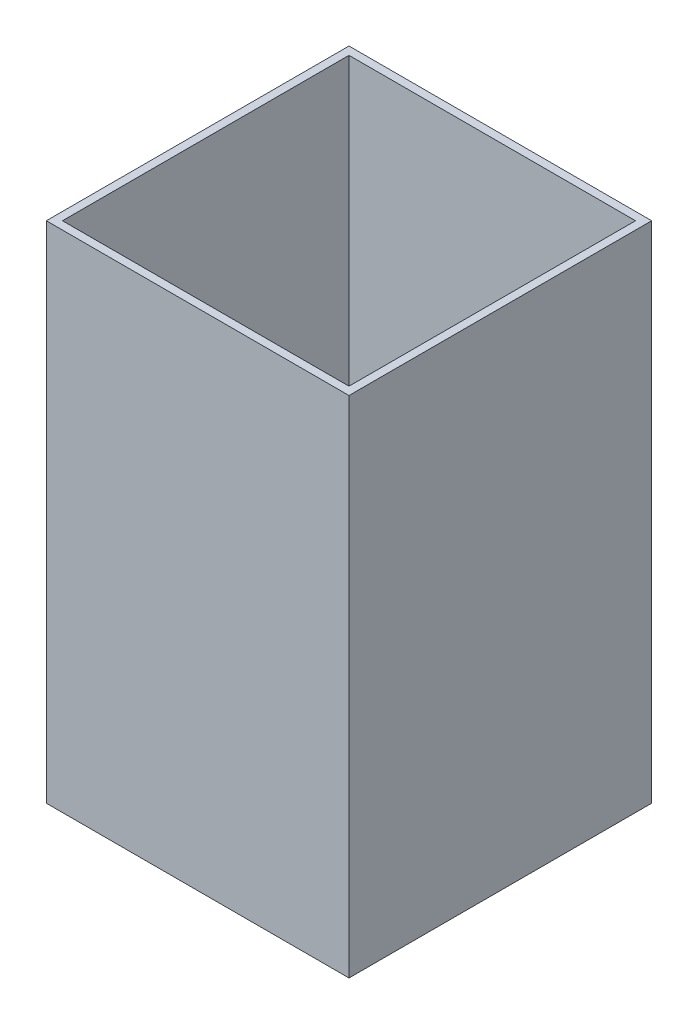
ISO-10303-21;
HEADER;
FILE_DESCRIPTION(('STEP AP214'),'2;1');
FILE_NAME('part.step','',(''),(''),'','','');
FILE_SCHEMA(('AUTOMOTIVE_DESIGN { 1 0 10303 214 1 1 1 1 }'));
ENDSEC;
DATA;
#1=APPLICATION_CONTEXT('core data for automotive mechanical design processes');
#2=APPLICATION_PROTOCOL_DEFINITION('international standard','automotive_design',2000,#1);
#3=PRODUCT_CONTEXT('',#1,'mechanical');
#4=PRODUCT('Part','Part','',(#3));
#5=PRODUCT_RELATED_PRODUCT_CATEGORY('part','',(#4));
#6=PRODUCT_DEFINITION_FORMATION('','',#4);
#7=PRODUCT_DEFINITION_CONTEXT('part definition',#1,'design');
#8=PRODUCT_DEFINITION('design','',#6,#7);
#9=PRODUCT_DEFINITION_SHAPE('','',#8);
#10=(LENGTH_UNIT() NAMED_UNIT(*) SI_UNIT(.MILLI.,.METRE.));
#11=(NAMED_UNIT(*) PLANE_ANGLE_UNIT() SI_UNIT($,.RADIAN.));
#12=(NAMED_UNIT(*) SI_UNIT($,.STERADIAN.) SOLID_ANGLE_UNIT());
#13=UNCERTAINTY_MEASURE_WITH_UNIT(LENGTH_MEASURE(1.E-05),#10,'distance_accuracy_value','');
#14=(GEOMETRIC_REPRESENTATION_CONTEXT(3) GLOBAL_UNCERTAINTY_ASSIGNED_CONTEXT((#13)) GLOBAL_UNIT_ASSIGNED_CONTEXT((#10,
#11,#12)) REPRESENTATION_CONTEXT('',''));
#15=CARTESIAN_POINT('',(0.,0.,0.));
#16=DIRECTION('',(0.,0.,1.));
#17=DIRECTION('',(1.,0.,0.));
#18=AXIS2_PLACEMENT_3D('',#15,#16,#17);
#19=CARTESIAN_POINT('',(0.,31.75,0.));
#20=DIRECTION('',(0.,-1.,0.));
#21=DIRECTION('',(0.,0.,-1.));
#22=AXIS2_PLACEMENT_3D('',#19,#20,#21);
#23=PLANE('',#22);
#24=DIRECTION('',(0.,0.,1.));
#25=VECTOR('',#24,1.);
#26=CARTESIAN_POINT('',(0.,31.75,0.));
#27=LINE('',#26,#25);
#28=CARTESIAN_POINT('',(0.,31.75,-19.05));
#29=VERTEX_POINT('',#28);
#30=CARTESIAN_POINT('',(0.,31.75,0.));
#31=VERTEX_POINT('',#30);
#32=EDGE_CURVE('E153',#29,#31,#27,.T.);
#33=ORIENTED_EDGE('',*,*,#32,.T.);
#34=DIRECTION('',(1.,0.,0.));
#35=VECTOR('',#34,1.);
#36=CARTESIAN_POINT('',(0.,31.75,0.));
#37=LINE('',#36,#35);
#38=CARTESIAN_POINT('',(19.05,31.75,0.));
#39=VERTEX_POINT('',#38);
#40=EDGE_CURVE('E157',#31,#39,#37,.T.);
#41=ORIENTED_EDGE('',*,*,#40,.T.);
#42=DIRECTION('',(0.,0.,-1.));
#43=VECTOR('',#42,1.);
#44=CARTESIAN_POINT('',(19.05,31.75,0.));
#45=LINE('',#44,#43);
#46=CARTESIAN_POINT('',(19.05,31.75,-19.05));
#47=VERTEX_POINT('',#46);
#48=EDGE_CURVE('E161',#39,#47,#45,.T.);
#49=ORIENTED_EDGE('',*,*,#48,.T.);
#50=DIRECTION('',(-1.,0.,0.));
#51=VECTOR('',#50,1.);
#52=CARTESIAN_POINT('',(0.,31.75,-19.05));
#53=LINE('',#52,#51);
#54=EDGE_CURVE('E164',#47,#29,#53,.T.);
#55=ORIENTED_EDGE('',*,*,#54,.T.);
#56=EDGE_LOOP('',(#33,#41,#49,#55));
#57=FACE_BOUND('',#56,.T.);
#58=DIRECTION('',(0.,0.,1.));
#59=VECTOR('',#58,1.);
#60=CARTESIAN_POINT('',(0.507999999999999,31.75,-18.542));
#61=LINE('',#60,#59);
#62=CARTESIAN_POINT('',(0.507999999999999,31.75,-18.542));
#63=VERTEX_POINT('',#62);
#64=CARTESIAN_POINT('',(0.508000000000002,31.75,-0.508));
#65=VERTEX_POINT('',#64);
#66=EDGE_CURVE('E105',#63,#65,#61,.T.);
#67=ORIENTED_EDGE('',*,*,#66,.F.);
#68=DIRECTION('',(-1.,0.,0.));
#69=VECTOR('',#68,1.);
#70=CARTESIAN_POINT('',(0.507999999999999,31.75,-18.542));
#71=LINE('',#70,#69);
#72=CARTESIAN_POINT('',(18.542,31.75,-18.542));
#73=VERTEX_POINT('',#72);
#74=EDGE_CURVE('E131',#73,#63,#71,.T.);
#75=ORIENTED_EDGE('',*,*,#74,.F.);
#76=DIRECTION('',(0.,0.,-1.));
#77=VECTOR('',#76,1.);
#78=CARTESIAN_POINT('',(18.542,31.75,-18.542));
#79=LINE('',#78,#77);
#80=CARTESIAN_POINT('',(18.542,31.75,-0.507999999999998));
#81=VERTEX_POINT('',#80);
#82=EDGE_CURVE('E127',#81,#73,#79,.T.);
#83=ORIENTED_EDGE('',*,*,#82,.F.);
#84=DIRECTION('',(1.,0.,0.));
#85=VECTOR('',#84,1.);
#86=CARTESIAN_POINT('',(0.508000000000002,31.75,-0.508));
#87=LINE('',#86,#85);
#88=EDGE_CURVE('E114',#65,#81,#87,.T.);
#89=ORIENTED_EDGE('',*,*,#88,.F.);
#90=EDGE_LOOP('',(#67,#75,#83,#89));
#91=FACE_BOUND('',#90,.T.);
#92=ADVANCED_FACE('F39',(#57,#91),#23,.F.);
#93=CARTESIAN_POINT('',(0.,0.,0.));
#94=DIRECTION('',(0.,-1.,0.));
#95=DIRECTION('',(0.,0.,-1.));
#96=AXIS2_PLACEMENT_3D('',#93,#94,#95);
#97=PLANE('',#96);
#98=DIRECTION('',(0.,0.,1.));
#99=VECTOR('',#98,1.);
#100=CARTESIAN_POINT('',(0.,0.,0.));
#101=LINE('',#100,#99);
#102=CARTESIAN_POINT('',(0.,0.,-19.05));
#103=VERTEX_POINT('',#102);
#104=CARTESIAN_POINT('',(0.,0.,0.));
#105=VERTEX_POINT('',#104);
#106=EDGE_CURVE('E123',#103,#105,#101,.T.);
#107=ORIENTED_EDGE('',*,*,#106,.F.);
#108=DIRECTION('',(-1.,0.,0.));
#109=VECTOR('',#108,1.);
#110=CARTESIAN_POINT('',(0.,0.,-19.05));
#111=LINE('',#110,#109);
#112=CARTESIAN_POINT('',(19.05,0.,-19.05));
#113=VERTEX_POINT('',#112);
#114=EDGE_CURVE('E158',#113,#103,#111,.T.);
#115=ORIENTED_EDGE('',*,*,#114,.F.);
#116=DIRECTION('',(0.,0.,-1.));
#117=VECTOR('',#116,1.);
#118=CARTESIAN_POINT('',(19.05,0.,0.));
#119=LINE('',#118,#117);
#120=CARTESIAN_POINT('',(19.05,0.,0.));
#121=VERTEX_POINT('',#120);
#122=EDGE_CURVE('E174',#121,#113,#119,.T.);
#123=ORIENTED_EDGE('',*,*,#122,.F.);
#124=DIRECTION('',(1.,0.,0.));
#125=VECTOR('',#124,1.);
#126=CARTESIAN_POINT('',(0.,0.,0.));
#127=LINE('',#126,#125);
#128=EDGE_CURVE('E171',#105,#121,#127,.T.);
#129=ORIENTED_EDGE('',*,*,#128,.F.);
#130=EDGE_LOOP('',(#107,#115,#123,#129));
#131=FACE_BOUND('',#130,.T.);
#132=DIRECTION('',(-1.,0.,0.));
#133=VECTOR('',#132,1.);
#134=CARTESIAN_POINT('',(0.507999999999999,0.,-18.542));
#135=LINE('',#134,#133);
#136=CARTESIAN_POINT('',(18.542,0.,-18.542));
#137=VERTEX_POINT('',#136);
#138=CARTESIAN_POINT('',(0.507999999999999,0.,-18.542));
#139=VERTEX_POINT('',#138);
#140=EDGE_CURVE('E115',#137,#139,#135,.T.);
#141=ORIENTED_EDGE('',*,*,#140,.T.);
#142=DIRECTION('',(0.,0.,1.));
#143=VECTOR('',#142,1.);
#144=CARTESIAN_POINT('',(0.507999999999999,0.,-18.542));
#145=LINE('',#144,#143);
#146=CARTESIAN_POINT('',(0.508000000000002,0.,-0.508));
#147=VERTEX_POINT('',#146);
#148=EDGE_CURVE('E63',#139,#147,#145,.T.);
#149=ORIENTED_EDGE('',*,*,#148,.T.);
#150=DIRECTION('',(1.,0.,0.));
#151=VECTOR('',#150,1.);
#152=CARTESIAN_POINT('',(0.508000000000002,0.,-0.508));
#153=LINE('',#152,#151);
#154=CARTESIAN_POINT('',(18.542,0.,-0.507999999999998));
#155=VERTEX_POINT('',#154);
#156=EDGE_CURVE('E121',#147,#155,#153,.T.);
#157=ORIENTED_EDGE('',*,*,#156,.T.);
#158=DIRECTION('',(0.,0.,-1.));
#159=VECTOR('',#158,1.);
#160=CARTESIAN_POINT('',(18.542,0.,-18.542));
#161=LINE('',#160,#159);
#162=EDGE_CURVE('E140',#155,#137,#161,.T.);
#163=ORIENTED_EDGE('',*,*,#162,.T.);
#164=EDGE_LOOP('',(#141,#149,#157,#163));
#165=FACE_BOUND('',#164,.T.);
#166=ADVANCED_FACE('F197',(#131,#165),#97,.T.);
#167=CARTESIAN_POINT('',(0.,31.75,0.));
#168=DIRECTION('',(1.,0.,0.));
#169=DIRECTION('',(0.,0.,-1.));
#170=AXIS2_PLACEMENT_3D('',#167,#168,#169);
#171=PLANE('',#170);
#172=ORIENTED_EDGE('',*,*,#106,.T.);
#173=DIRECTION('',(0.,-1.,0.));
#174=VECTOR('',#173,1.);
#175=CARTESIAN_POINT('',(0.,31.75,0.));
#176=LINE('',#175,#174);
#177=EDGE_CURVE('E11',#31,#105,#176,.T.);
#178=ORIENTED_EDGE('',*,*,#177,.F.);
#179=ORIENTED_EDGE('',*,*,#32,.F.);
#180=DIRECTION('',(0.,-1.,0.));
#181=VECTOR('',#180,1.);
#182=CARTESIAN_POINT('',(0.,31.75,-19.05));
#183=LINE('',#182,#181);
#184=EDGE_CURVE('E167',#29,#103,#183,.T.);
#185=ORIENTED_EDGE('',*,*,#184,.T.);
#186=EDGE_LOOP('',(#172,#178,#179,#185));
#187=FACE_BOUND('',#186,.T.);
#188=ADVANCED_FACE('F41',(#187),#171,.F.);
#189=CARTESIAN_POINT('',(0.,31.75,0.));
#190=DIRECTION('',(0.,0.,-1.));
#191=DIRECTION('',(-1.,0.,0.));
#192=AXIS2_PLACEMENT_3D('',#189,#190,#191);
#193=PLANE('',#192);
#194=ORIENTED_EDGE('',*,*,#128,.T.);
#195=DIRECTION('',(0.,-1.,0.));
#196=VECTOR('',#195,1.);
#197=CARTESIAN_POINT('',(19.05,31.75,0.));
#198=LINE('',#197,#196);
#199=EDGE_CURVE('E48',#39,#121,#198,.T.);
#200=ORIENTED_EDGE('',*,*,#199,.F.);
#201=ORIENTED_EDGE('',*,*,#40,.F.);
#202=ORIENTED_EDGE('',*,*,#177,.T.);
#203=EDGE_LOOP('',(#194,#200,#201,#202));
#204=FACE_BOUND('',#203,.T.);
#205=ADVANCED_FACE('F207',(#204),#193,.F.);
#206=CARTESIAN_POINT('',(19.05,31.75,0.));
#207=DIRECTION('',(-1.,0.,0.));
#208=DIRECTION('',(0.,0.,1.));
#209=AXIS2_PLACEMENT_3D('',#206,#207,#208);
#210=PLANE('',#209);
#211=ORIENTED_EDGE('',*,*,#122,.T.);
#212=DIRECTION('',(0.,-1.,0.));
#213=VECTOR('',#212,1.);
#214=CARTESIAN_POINT('',(19.05,31.75,-19.05));
#215=LINE('',#214,#213);
#216=EDGE_CURVE('E182',#47,#113,#215,.T.);
#217=ORIENTED_EDGE('',*,*,#216,.F.);
#218=ORIENTED_EDGE('',*,*,#48,.F.);
#219=ORIENTED_EDGE('',*,*,#199,.T.);
#220=EDGE_LOOP('',(#211,#217,#218,#219));
#221=FACE_BOUND('',#220,.T.);
#222=ADVANCED_FACE('F191',(#221),#210,.F.);
#223=CARTESIAN_POINT('',(0.,31.75,-19.05));
#224=DIRECTION('',(0.,0.,1.));
#225=DIRECTION('',(1.,0.,0.));
#226=AXIS2_PLACEMENT_3D('',#223,#224,#225);
#227=PLANE('',#226);
#228=ORIENTED_EDGE('',*,*,#114,.T.);
#229=ORIENTED_EDGE('',*,*,#184,.F.);
#230=ORIENTED_EDGE('',*,*,#54,.F.);
#231=ORIENTED_EDGE('',*,*,#216,.T.);
#232=EDGE_LOOP('',(#228,#229,#230,#231));
#233=FACE_BOUND('',#232,.T.);
#234=ADVANCED_FACE('F201',(#233),#227,.F.);
#235=CARTESIAN_POINT('',(0.507999999999999,31.75,-18.542));
#236=DIRECTION('',(1.,0.,0.));
#237=DIRECTION('',(0.,0.,-1.));
#238=AXIS2_PLACEMENT_3D('',#235,#236,#237);
#239=PLANE('',#238);
#240=ORIENTED_EDGE('',*,*,#148,.F.);
#241=DIRECTION('',(0.,-1.,0.));
#242=VECTOR('',#241,1.);
#243=CARTESIAN_POINT('',(0.507999999999999,31.75,-18.542));
#244=LINE('',#243,#242);
#245=EDGE_CURVE('E109',#63,#139,#244,.T.);
#246=ORIENTED_EDGE('',*,*,#245,.F.);
#247=ORIENTED_EDGE('',*,*,#66,.T.);
#248=DIRECTION('',(0.,-1.,0.));
#249=VECTOR('',#248,1.);
#250=CARTESIAN_POINT('',(0.508000000000002,31.75,-0.508));
#251=LINE('',#250,#249);
#252=EDGE_CURVE('E108',#65,#147,#251,.T.);
#253=ORIENTED_EDGE('',*,*,#252,.T.);
#254=EDGE_LOOP('',(#240,#246,#247,#253));
#255=FACE_BOUND('',#254,.T.);
#256=ADVANCED_FACE('F107',(#255),#239,.T.);
#257=CARTESIAN_POINT('',(0.508000000000002,31.75,-0.508));
#258=DIRECTION('',(0.,0.,-1.));
#259=DIRECTION('',(-1.,0.,0.));
#260=AXIS2_PLACEMENT_3D('',#257,#258,#259);
#261=PLANE('',#260);
#262=ORIENTED_EDGE('',*,*,#156,.F.);
#263=ORIENTED_EDGE('',*,*,#252,.F.);
#264=ORIENTED_EDGE('',*,*,#88,.T.);
#265=DIRECTION('',(0.,-1.,0.));
#266=VECTOR('',#265,1.);
#267=CARTESIAN_POINT('',(18.542,31.75,-0.507999999999998));
#268=LINE('',#267,#266);
#269=EDGE_CURVE('E124',#81,#155,#268,.T.);
#270=ORIENTED_EDGE('',*,*,#269,.T.);
#271=EDGE_LOOP('',(#262,#263,#264,#270));
#272=FACE_BOUND('',#271,.T.);
#273=ADVANCED_FACE('F118',(#272),#261,.T.);
#274=CARTESIAN_POINT('',(18.542,31.75,-18.542));
#275=DIRECTION('',(-1.,0.,0.));
#276=DIRECTION('',(0.,0.,1.));
#277=AXIS2_PLACEMENT_3D('',#274,#275,#276);
#278=PLANE('',#277);
#279=ORIENTED_EDGE('',*,*,#162,.F.);
#280=ORIENTED_EDGE('',*,*,#269,.F.);
#281=ORIENTED_EDGE('',*,*,#82,.T.);
#282=DIRECTION('',(0.,-1.,0.));
#283=VECTOR('',#282,1.);
#284=CARTESIAN_POINT('',(18.542,31.75,-18.542));
#285=LINE('',#284,#283);
#286=EDGE_CURVE('E55',#73,#137,#285,.T.);
#287=ORIENTED_EDGE('',*,*,#286,.T.);
#288=EDGE_LOOP('',(#279,#280,#281,#287));
#289=FACE_BOUND('',#288,.T.);
#290=ADVANCED_FACE('F230',(#289),#278,.T.);
#291=CARTESIAN_POINT('',(0.507999999999999,31.75,-18.542));
#292=DIRECTION('',(0.,0.,1.));
#293=DIRECTION('',(1.,0.,0.));
#294=AXIS2_PLACEMENT_3D('',#291,#292,#293);
#295=PLANE('',#294);
#296=ORIENTED_EDGE('',*,*,#140,.F.);
#297=ORIENTED_EDGE('',*,*,#286,.F.);
#298=ORIENTED_EDGE('',*,*,#74,.T.);
#299=ORIENTED_EDGE('',*,*,#245,.T.);
#300=EDGE_LOOP('',(#296,#297,#298,#299));
#301=FACE_BOUND('',#300,.T.);
#302=ADVANCED_FACE('F234',(#301),#295,.T.);
#303=CLOSED_SHELL('',(#92,#166,#188,#205,#222,#234,#256,#273,#290,#302));
#304=MANIFOLD_SOLID_BREP('B2',#303);
#305=ADVANCED_BREP_SHAPE_REPRESENTATION('',(#18,#304),#14);
#306=SHAPE_DEFINITION_REPRESENTATION(#9,#305);
ENDSEC;
END-ISO-10303-21;
